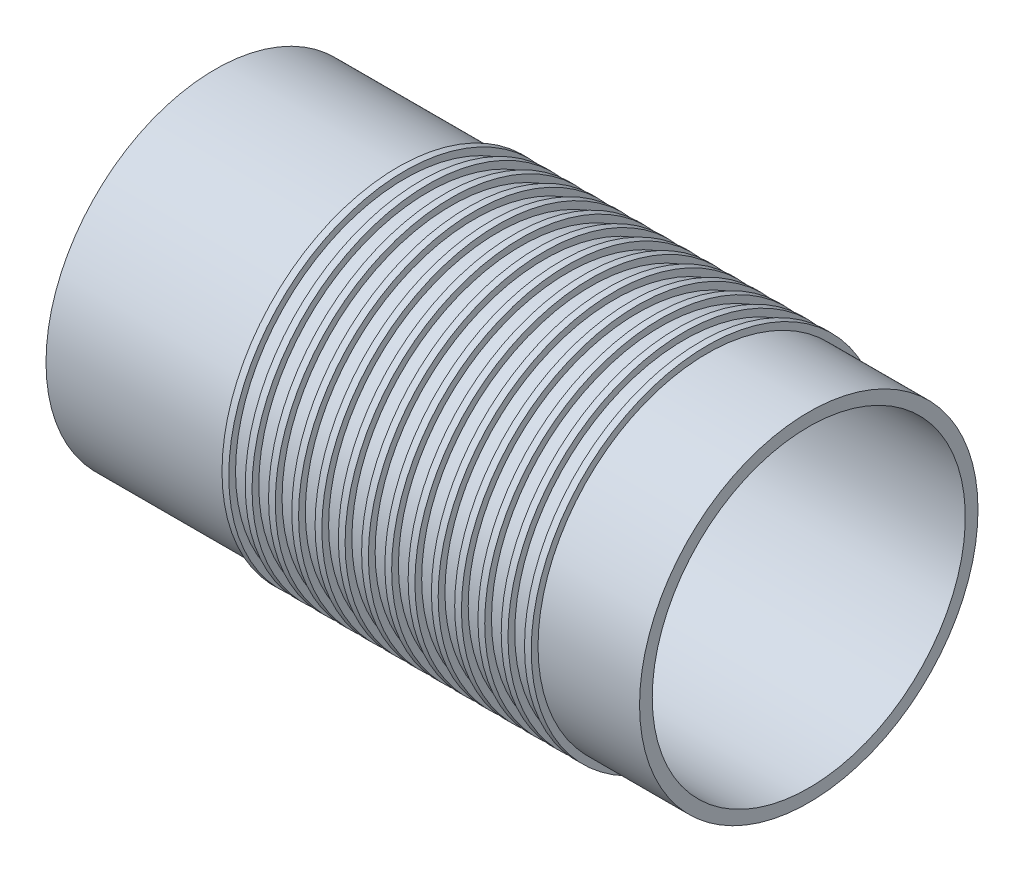
ISO-10303-21;
HEADER;
FILE_DESCRIPTION(('STEP AP214'),'2;1');
FILE_NAME('part.step','',(''),(''),'','','');
FILE_SCHEMA(('AUTOMOTIVE_DESIGN { 1 0 10303 214 1 1 1 1 }'));
ENDSEC;
DATA;
#1=APPLICATION_CONTEXT('core data for automotive mechanical design processes');
#2=APPLICATION_PROTOCOL_DEFINITION('international standard','automotive_design',2000,#1);
#3=PRODUCT_CONTEXT('',#1,'mechanical');
#4=PRODUCT('Part','Part','',(#3));
#5=PRODUCT_RELATED_PRODUCT_CATEGORY('part','',(#4));
#6=PRODUCT_DEFINITION_FORMATION('','',#4);
#7=PRODUCT_DEFINITION_CONTEXT('part definition',#1,'design');
#8=PRODUCT_DEFINITION('design','',#6,#7);
#9=PRODUCT_DEFINITION_SHAPE('','',#8);
#10=(LENGTH_UNIT() NAMED_UNIT(*) SI_UNIT(.MILLI.,.METRE.));
#11=(NAMED_UNIT(*) PLANE_ANGLE_UNIT() SI_UNIT($,.RADIAN.));
#12=(NAMED_UNIT(*) SI_UNIT($,.STERADIAN.) SOLID_ANGLE_UNIT());
#13=UNCERTAINTY_MEASURE_WITH_UNIT(LENGTH_MEASURE(1.E-05),#10,'distance_accuracy_value','');
#14=(GEOMETRIC_REPRESENTATION_CONTEXT(3) GLOBAL_UNCERTAINTY_ASSIGNED_CONTEXT((#13)) GLOBAL_UNIT_ASSIGNED_CONTEXT((#10,
#11,#12)) REPRESENTATION_CONTEXT('',''));
#15=CARTESIAN_POINT('',(0.,0.,0.));
#16=DIRECTION('',(0.,0.,1.));
#17=DIRECTION('',(1.,0.,0.));
#18=AXIS2_PLACEMENT_3D('',#15,#16,#17);
#19=CARTESIAN_POINT('',(-35.075,18.5,0.));
#20=DIRECTION('',(1.,0.,0.));
#21=DIRECTION('',(0.,0.,-1.));
#22=AXIS2_PLACEMENT_3D('',#19,#20,#21);
#23=PLANE('',#22);
#24=CARTESIAN_POINT('',(-35.075,0.,0.));
#25=DIRECTION('',(-1.,0.,0.));
#26=DIRECTION('',(0.,0.,1.));
#27=AXIS2_PLACEMENT_3D('',#24,#25,#26);
#28=CIRCLE('',#27,18.5);
#29=CARTESIAN_POINT('',(-35.075,0.,18.5));
#30=VERTEX_POINT('',#29);
#31=EDGE_CURVE('E10',#30,#30,#28,.T.);
#32=ORIENTED_EDGE('',*,*,#31,.F.);
#33=EDGE_LOOP('',(#32));
#34=FACE_BOUND('',#33,.T.);
#35=CARTESIAN_POINT('',(-35.075,0.,0.));
#36=DIRECTION('',(-1.,0.,0.));
#37=DIRECTION('',(0.,0.,1.));
#38=AXIS2_PLACEMENT_3D('',#35,#36,#37);
#39=CIRCLE('',#38,20.);
#40=CARTESIAN_POINT('',(-35.075,0.,20.));
#41=VERTEX_POINT('',#40);
#42=EDGE_CURVE('E227',#41,#41,#39,.T.);
#43=ORIENTED_EDGE('',*,*,#42,.T.);
#44=EDGE_LOOP('',(#43));
#45=FACE_BOUND('',#44,.T.);
#46=ADVANCED_FACE('F43',(#34,#45),#23,.F.);
#47=CARTESIAN_POINT('',(-100.187905083293,0.,0.));
#48=DIRECTION('',(-1.,0.,0.));
#49=DIRECTION('',(0.,0.,1.));
#50=AXIS2_PLACEMENT_3D('',#47,#48,#49);
#51=CYLINDRICAL_SURFACE('',#50,18.5);
#52=CARTESIAN_POINT('',(35.075,0.,0.));
#53=DIRECTION('',(-1.,0.,0.));
#54=DIRECTION('',(0.,0.,1.));
#55=AXIS2_PLACEMENT_3D('',#52,#53,#54);
#56=CIRCLE('',#55,18.5);
#57=CARTESIAN_POINT('',(35.075,0.,18.5));
#58=VERTEX_POINT('',#57);
#59=EDGE_CURVE('E49',#58,#58,#56,.T.);
#60=ORIENTED_EDGE('',*,*,#59,.F.);
#61=EDGE_LOOP('',(#60));
#62=FACE_BOUND('',#61,.T.);
#63=ORIENTED_EDGE('',*,*,#31,.T.);
#64=EDGE_LOOP('',(#63));
#65=FACE_BOUND('',#64,.T.);
#66=ADVANCED_FACE('F576',(#62,#65),#51,.F.);
#67=CARTESIAN_POINT('',(35.075,18.5,0.));
#68=DIRECTION('',(-1.,0.,0.));
#69=DIRECTION('',(0.,0.,1.));
#70=AXIS2_PLACEMENT_3D('',#67,#68,#69);
#71=PLANE('',#70);
#72=CARTESIAN_POINT('',(35.075,0.,0.));
#73=DIRECTION('',(-1.,0.,0.));
#74=DIRECTION('',(0.,0.,1.));
#75=AXIS2_PLACEMENT_3D('',#72,#73,#74);
#76=CIRCLE('',#75,20.);
#77=CARTESIAN_POINT('',(35.075,0.,20.));
#78=VERTEX_POINT('',#77);
#79=EDGE_CURVE('E53',#78,#78,#76,.T.);
#80=ORIENTED_EDGE('',*,*,#79,.F.);
#81=EDGE_LOOP('',(#80));
#82=FACE_BOUND('',#81,.T.);
#83=ORIENTED_EDGE('',*,*,#59,.T.);
#84=EDGE_LOOP('',(#83));
#85=FACE_BOUND('',#84,.T.);
#86=ADVANCED_FACE('F571',(#82,#85),#71,.F.);
#87=CARTESIAN_POINT('',(-100.187905083293,0.,0.));
#88=DIRECTION('',(-1.,0.,0.));
#89=DIRECTION('',(0.,0.,1.));
#90=AXIS2_PLACEMENT_3D('',#87,#88,#89);
#91=CYLINDRICAL_SURFACE('',#90,20.);
#92=CARTESIAN_POINT('',(23.075,0.,0.));
#93=DIRECTION('',(-1.,0.,0.));
#94=DIRECTION('',(0.,0.,1.));
#95=AXIS2_PLACEMENT_3D('',#92,#93,#94);
#96=CIRCLE('',#95,20.);
#97=CARTESIAN_POINT('',(23.075,0.,20.));
#98=VERTEX_POINT('',#97);
#99=EDGE_CURVE('E57',#98,#98,#96,.T.);
#100=ORIENTED_EDGE('',*,*,#99,.F.);
#101=EDGE_LOOP('',(#100));
#102=FACE_BOUND('',#101,.T.);
#103=ORIENTED_EDGE('',*,*,#79,.T.);
#104=EDGE_LOOP('',(#103));
#105=FACE_BOUND('',#104,.T.);
#106=ADVANCED_FACE('F565',(#102,#105),#91,.T.);
#107=CARTESIAN_POINT('',(23.075,20.,0.));
#108=DIRECTION('',(-1.,0.,0.));
#109=DIRECTION('',(0.,0.,1.));
#110=AXIS2_PLACEMENT_3D('',#107,#108,#109);
#111=PLANE('',#110);
#112=CARTESIAN_POINT('',(23.075,0.,0.));
#113=DIRECTION('',(-1.,0.,0.));
#114=DIRECTION('',(0.,0.,1.));
#115=AXIS2_PLACEMENT_3D('',#112,#113,#114);
#116=CIRCLE('',#115,20.8);
#117=CARTESIAN_POINT('',(23.075,0.,20.8));
#118=VERTEX_POINT('',#117);
#119=EDGE_CURVE('E62',#118,#118,#116,.T.);
#120=ORIENTED_EDGE('',*,*,#119,.F.);
#121=EDGE_LOOP('',(#120));
#122=FACE_BOUND('',#121,.T.);
#123=ORIENTED_EDGE('',*,*,#99,.T.);
#124=EDGE_LOOP('',(#123));
#125=FACE_BOUND('',#124,.T.);
#126=ADVANCED_FACE('F559',(#122,#125),#111,.F.);
#127=CARTESIAN_POINT('',(-100.187905083293,0.,0.));
#128=DIRECTION('',(-1.,0.,0.));
#129=DIRECTION('',(0.,0.,1.));
#130=AXIS2_PLACEMENT_3D('',#127,#128,#129);
#131=CYLINDRICAL_SURFACE('',#130,20.8);
#132=CARTESIAN_POINT('',(22.275,0.,0.));
#133=DIRECTION('',(-1.,0.,0.));
#134=DIRECTION('',(0.,0.,1.));
#135=AXIS2_PLACEMENT_3D('',#132,#133,#134);
#136=CIRCLE('',#135,20.8);
#137=CARTESIAN_POINT('',(22.275,0.,20.8));
#138=VERTEX_POINT('',#137);
#139=EDGE_CURVE('E65',#138,#138,#136,.T.);
#140=ORIENTED_EDGE('',*,*,#139,.F.);
#141=EDGE_LOOP('',(#140));
#142=FACE_BOUND('',#141,.T.);
#143=ORIENTED_EDGE('',*,*,#119,.T.);
#144=EDGE_LOOP('',(#143));
#145=FACE_BOUND('',#144,.T.);
#146=ADVANCED_FACE('F553',(#142,#145),#131,.T.);
#147=CARTESIAN_POINT('',(22.275,20.8,0.));
#148=DIRECTION('',(1.,0.,0.));
#149=DIRECTION('',(0.,0.,-1.));
#150=AXIS2_PLACEMENT_3D('',#147,#148,#149);
#151=PLANE('',#150);
#152=CARTESIAN_POINT('',(22.275,0.,0.));
#153=DIRECTION('',(-1.,0.,0.));
#154=DIRECTION('',(0.,0.,1.));
#155=AXIS2_PLACEMENT_3D('',#152,#153,#154);
#156=CIRCLE('',#155,20.);
#157=CARTESIAN_POINT('',(22.275,0.,20.));
#158=VERTEX_POINT('',#157);
#159=EDGE_CURVE('E68',#158,#158,#156,.T.);
#160=ORIENTED_EDGE('',*,*,#159,.F.);
#161=EDGE_LOOP('',(#160));
#162=FACE_BOUND('',#161,.T.);
#163=ORIENTED_EDGE('',*,*,#139,.T.);
#164=EDGE_LOOP('',(#163));
#165=FACE_BOUND('',#164,.T.);
#166=ADVANCED_FACE('F547',(#162,#165),#151,.F.);
#167=CARTESIAN_POINT('',(-100.187905083293,0.,0.));
#168=DIRECTION('',(-1.,0.,0.));
#169=DIRECTION('',(0.,0.,1.));
#170=AXIS2_PLACEMENT_3D('',#167,#168,#169);
#171=CYLINDRICAL_SURFACE('',#170,20.);
#172=CARTESIAN_POINT('',(20.325,0.,0.));
#173=DIRECTION('',(-1.,0.,0.));
#174=DIRECTION('',(0.,0.,1.));
#175=AXIS2_PLACEMENT_3D('',#172,#173,#174);
#176=CIRCLE('',#175,20.);
#177=CARTESIAN_POINT('',(20.325,0.,20.));
#178=VERTEX_POINT('',#177);
#179=EDGE_CURVE('E71',#178,#178,#176,.T.);
#180=ORIENTED_EDGE('',*,*,#179,.F.);
#181=EDGE_LOOP('',(#180));
#182=FACE_BOUND('',#181,.T.);
#183=ORIENTED_EDGE('',*,*,#159,.T.);
#184=EDGE_LOOP('',(#183));
#185=FACE_BOUND('',#184,.T.);
#186=ADVANCED_FACE('F541',(#182,#185),#171,.T.);
#187=CARTESIAN_POINT('',(20.325,20.,0.));
#188=DIRECTION('',(-1.,0.,0.));
#189=DIRECTION('',(0.,0.,1.));
#190=AXIS2_PLACEMENT_3D('',#187,#188,#189);
#191=PLANE('',#190);
#192=CARTESIAN_POINT('',(20.325,0.,0.));
#193=DIRECTION('',(-1.,0.,0.));
#194=DIRECTION('',(0.,0.,1.));
#195=AXIS2_PLACEMENT_3D('',#192,#193,#194);
#196=CIRCLE('',#195,20.8);
#197=CARTESIAN_POINT('',(20.325,0.,20.8));
#198=VERTEX_POINT('',#197);
#199=EDGE_CURVE('E74',#198,#198,#196,.T.);
#200=ORIENTED_EDGE('',*,*,#199,.F.);
#201=EDGE_LOOP('',(#200));
#202=FACE_BOUND('',#201,.T.);
#203=ORIENTED_EDGE('',*,*,#179,.T.);
#204=EDGE_LOOP('',(#203));
#205=FACE_BOUND('',#204,.T.);
#206=ADVANCED_FACE('F535',(#202,#205),#191,.F.);
#207=CARTESIAN_POINT('',(-100.187905083293,0.,0.));
#208=DIRECTION('',(-1.,0.,0.));
#209=DIRECTION('',(0.,0.,1.));
#210=AXIS2_PLACEMENT_3D('',#207,#208,#209);
#211=CYLINDRICAL_SURFACE('',#210,20.8);
#212=CARTESIAN_POINT('',(19.525,0.,0.));
#213=DIRECTION('',(-1.,0.,0.));
#214=DIRECTION('',(0.,0.,1.));
#215=AXIS2_PLACEMENT_3D('',#212,#213,#214);
#216=CIRCLE('',#215,20.8);
#217=CARTESIAN_POINT('',(19.525,0.,20.8));
#218=VERTEX_POINT('',#217);
#219=EDGE_CURVE('E77',#218,#218,#216,.T.);
#220=ORIENTED_EDGE('',*,*,#219,.F.);
#221=EDGE_LOOP('',(#220));
#222=FACE_BOUND('',#221,.T.);
#223=ORIENTED_EDGE('',*,*,#199,.T.);
#224=EDGE_LOOP('',(#223));
#225=FACE_BOUND('',#224,.T.);
#226=ADVANCED_FACE('F529',(#222,#225),#211,.T.);
#227=CARTESIAN_POINT('',(19.525,20.8,0.));
#228=DIRECTION('',(1.,0.,0.));
#229=DIRECTION('',(0.,0.,-1.));
#230=AXIS2_PLACEMENT_3D('',#227,#228,#229);
#231=PLANE('',#230);
#232=CARTESIAN_POINT('',(19.525,0.,0.));
#233=DIRECTION('',(-1.,0.,0.));
#234=DIRECTION('',(0.,0.,1.));
#235=AXIS2_PLACEMENT_3D('',#232,#233,#234);
#236=CIRCLE('',#235,20.);
#237=CARTESIAN_POINT('',(19.525,0.,20.));
#238=VERTEX_POINT('',#237);
#239=EDGE_CURVE('E80',#238,#238,#236,.T.);
#240=ORIENTED_EDGE('',*,*,#239,.F.);
#241=EDGE_LOOP('',(#240));
#242=FACE_BOUND('',#241,.T.);
#243=ORIENTED_EDGE('',*,*,#219,.T.);
#244=EDGE_LOOP('',(#243));
#245=FACE_BOUND('',#244,.T.);
#246=ADVANCED_FACE('F523',(#242,#245),#231,.F.);
#247=CARTESIAN_POINT('',(-100.187905083293,0.,0.));
#248=DIRECTION('',(-1.,0.,0.));
#249=DIRECTION('',(0.,0.,1.));
#250=AXIS2_PLACEMENT_3D('',#247,#248,#249);
#251=CYLINDRICAL_SURFACE('',#250,20.);
#252=CARTESIAN_POINT('',(17.575,0.,0.));
#253=DIRECTION('',(-1.,0.,0.));
#254=DIRECTION('',(0.,0.,1.));
#255=AXIS2_PLACEMENT_3D('',#252,#253,#254);
#256=CIRCLE('',#255,20.);
#257=CARTESIAN_POINT('',(17.575,0.,20.));
#258=VERTEX_POINT('',#257);
#259=EDGE_CURVE('E83',#258,#258,#256,.T.);
#260=ORIENTED_EDGE('',*,*,#259,.F.);
#261=EDGE_LOOP('',(#260));
#262=FACE_BOUND('',#261,.T.);
#263=ORIENTED_EDGE('',*,*,#239,.T.);
#264=EDGE_LOOP('',(#263));
#265=FACE_BOUND('',#264,.T.);
#266=ADVANCED_FACE('F517',(#262,#265),#251,.T.);
#267=CARTESIAN_POINT('',(17.575,20.,0.));
#268=DIRECTION('',(-1.,0.,0.));
#269=DIRECTION('',(0.,0.,1.));
#270=AXIS2_PLACEMENT_3D('',#267,#268,#269);
#271=PLANE('',#270);
#272=CARTESIAN_POINT('',(17.575,0.,0.));
#273=DIRECTION('',(-1.,0.,0.));
#274=DIRECTION('',(0.,0.,1.));
#275=AXIS2_PLACEMENT_3D('',#272,#273,#274);
#276=CIRCLE('',#275,20.8);
#277=CARTESIAN_POINT('',(17.575,0.,20.8));
#278=VERTEX_POINT('',#277);
#279=EDGE_CURVE('E86',#278,#278,#276,.T.);
#280=ORIENTED_EDGE('',*,*,#279,.F.);
#281=EDGE_LOOP('',(#280));
#282=FACE_BOUND('',#281,.T.);
#283=ORIENTED_EDGE('',*,*,#259,.T.);
#284=EDGE_LOOP('',(#283));
#285=FACE_BOUND('',#284,.T.);
#286=ADVANCED_FACE('F511',(#282,#285),#271,.F.);
#287=CARTESIAN_POINT('',(-100.187905083293,0.,0.));
#288=DIRECTION('',(-1.,0.,0.));
#289=DIRECTION('',(0.,0.,1.));
#290=AXIS2_PLACEMENT_3D('',#287,#288,#289);
#291=CYLINDRICAL_SURFACE('',#290,20.8);
#292=CARTESIAN_POINT('',(16.775,0.,0.));
#293=DIRECTION('',(-1.,0.,0.));
#294=DIRECTION('',(0.,0.,1.));
#295=AXIS2_PLACEMENT_3D('',#292,#293,#294);
#296=CIRCLE('',#295,20.8);
#297=CARTESIAN_POINT('',(16.775,0.,20.8));
#298=VERTEX_POINT('',#297);
#299=EDGE_CURVE('E89',#298,#298,#296,.T.);
#300=ORIENTED_EDGE('',*,*,#299,.F.);
#301=EDGE_LOOP('',(#300));
#302=FACE_BOUND('',#301,.T.);
#303=ORIENTED_EDGE('',*,*,#279,.T.);
#304=EDGE_LOOP('',(#303));
#305=FACE_BOUND('',#304,.T.);
#306=ADVANCED_FACE('F505',(#302,#305),#291,.T.);
#307=CARTESIAN_POINT('',(16.775,20.8,0.));
#308=DIRECTION('',(1.,0.,0.));
#309=DIRECTION('',(0.,0.,-1.));
#310=AXIS2_PLACEMENT_3D('',#307,#308,#309);
#311=PLANE('',#310);
#312=CARTESIAN_POINT('',(16.775,0.,0.));
#313=DIRECTION('',(-1.,0.,0.));
#314=DIRECTION('',(0.,0.,1.));
#315=AXIS2_PLACEMENT_3D('',#312,#313,#314);
#316=CIRCLE('',#315,20.);
#317=CARTESIAN_POINT('',(16.775,0.,20.));
#318=VERTEX_POINT('',#317);
#319=EDGE_CURVE('E92',#318,#318,#316,.T.);
#320=ORIENTED_EDGE('',*,*,#319,.F.);
#321=EDGE_LOOP('',(#320));
#322=FACE_BOUND('',#321,.T.);
#323=ORIENTED_EDGE('',*,*,#299,.T.);
#324=EDGE_LOOP('',(#323));
#325=FACE_BOUND('',#324,.T.);
#326=ADVANCED_FACE('F499',(#322,#325),#311,.F.);
#327=CARTESIAN_POINT('',(-100.187905083293,0.,0.));
#328=DIRECTION('',(-1.,0.,0.));
#329=DIRECTION('',(0.,0.,1.));
#330=AXIS2_PLACEMENT_3D('',#327,#328,#329);
#331=CYLINDRICAL_SURFACE('',#330,20.);
#332=CARTESIAN_POINT('',(14.825,0.,0.));
#333=DIRECTION('',(-1.,0.,0.));
#334=DIRECTION('',(0.,0.,1.));
#335=AXIS2_PLACEMENT_3D('',#332,#333,#334);
#336=CIRCLE('',#335,20.);
#337=CARTESIAN_POINT('',(14.825,0.,20.));
#338=VERTEX_POINT('',#337);
#339=EDGE_CURVE('E95',#338,#338,#336,.T.);
#340=ORIENTED_EDGE('',*,*,#339,.F.);
#341=EDGE_LOOP('',(#340));
#342=FACE_BOUND('',#341,.T.);
#343=ORIENTED_EDGE('',*,*,#319,.T.);
#344=EDGE_LOOP('',(#343));
#345=FACE_BOUND('',#344,.T.);
#346=ADVANCED_FACE('F493',(#342,#345),#331,.T.);
#347=CARTESIAN_POINT('',(14.825,20.,0.));
#348=DIRECTION('',(-1.,0.,0.));
#349=DIRECTION('',(0.,0.,1.));
#350=AXIS2_PLACEMENT_3D('',#347,#348,#349);
#351=PLANE('',#350);
#352=CARTESIAN_POINT('',(14.825,0.,0.));
#353=DIRECTION('',(-1.,0.,0.));
#354=DIRECTION('',(0.,0.,1.));
#355=AXIS2_PLACEMENT_3D('',#352,#353,#354);
#356=CIRCLE('',#355,20.8);
#357=CARTESIAN_POINT('',(14.825,0.,20.8));
#358=VERTEX_POINT('',#357);
#359=EDGE_CURVE('E98',#358,#358,#356,.T.);
#360=ORIENTED_EDGE('',*,*,#359,.F.);
#361=EDGE_LOOP('',(#360));
#362=FACE_BOUND('',#361,.T.);
#363=ORIENTED_EDGE('',*,*,#339,.T.);
#364=EDGE_LOOP('',(#363));
#365=FACE_BOUND('',#364,.T.);
#366=ADVANCED_FACE('F487',(#362,#365),#351,.F.);
#367=CARTESIAN_POINT('',(-100.187905083293,0.,0.));
#368=DIRECTION('',(-1.,0.,0.));
#369=DIRECTION('',(0.,0.,1.));
#370=AXIS2_PLACEMENT_3D('',#367,#368,#369);
#371=CYLINDRICAL_SURFACE('',#370,20.8);
#372=CARTESIAN_POINT('',(14.025,0.,0.));
#373=DIRECTION('',(-1.,0.,0.));
#374=DIRECTION('',(0.,0.,1.));
#375=AXIS2_PLACEMENT_3D('',#372,#373,#374);
#376=CIRCLE('',#375,20.8);
#377=CARTESIAN_POINT('',(14.025,0.,20.8));
#378=VERTEX_POINT('',#377);
#379=EDGE_CURVE('E101',#378,#378,#376,.T.);
#380=ORIENTED_EDGE('',*,*,#379,.F.);
#381=EDGE_LOOP('',(#380));
#382=FACE_BOUND('',#381,.T.);
#383=ORIENTED_EDGE('',*,*,#359,.T.);
#384=EDGE_LOOP('',(#383));
#385=FACE_BOUND('',#384,.T.);
#386=ADVANCED_FACE('F481',(#382,#385),#371,.T.);
#387=CARTESIAN_POINT('',(14.025,20.8,0.));
#388=DIRECTION('',(1.,0.,0.));
#389=DIRECTION('',(0.,0.,-1.));
#390=AXIS2_PLACEMENT_3D('',#387,#388,#389);
#391=PLANE('',#390);
#392=CARTESIAN_POINT('',(14.025,0.,0.));
#393=DIRECTION('',(-1.,0.,0.));
#394=DIRECTION('',(0.,0.,1.));
#395=AXIS2_PLACEMENT_3D('',#392,#393,#394);
#396=CIRCLE('',#395,20.);
#397=CARTESIAN_POINT('',(14.025,0.,20.));
#398=VERTEX_POINT('',#397);
#399=EDGE_CURVE('E104',#398,#398,#396,.T.);
#400=ORIENTED_EDGE('',*,*,#399,.F.);
#401=EDGE_LOOP('',(#400));
#402=FACE_BOUND('',#401,.T.);
#403=ORIENTED_EDGE('',*,*,#379,.T.);
#404=EDGE_LOOP('',(#403));
#405=FACE_BOUND('',#404,.T.);
#406=ADVANCED_FACE('F475',(#402,#405),#391,.F.);
#407=CARTESIAN_POINT('',(-100.187905083293,0.,0.));
#408=DIRECTION('',(-1.,0.,0.));
#409=DIRECTION('',(0.,0.,1.));
#410=AXIS2_PLACEMENT_3D('',#407,#408,#409);
#411=CYLINDRICAL_SURFACE('',#410,20.);
#412=CARTESIAN_POINT('',(12.075,0.,0.));
#413=DIRECTION('',(-1.,0.,0.));
#414=DIRECTION('',(0.,0.,1.));
#415=AXIS2_PLACEMENT_3D('',#412,#413,#414);
#416=CIRCLE('',#415,20.);
#417=CARTESIAN_POINT('',(12.075,0.,20.));
#418=VERTEX_POINT('',#417);
#419=EDGE_CURVE('E107',#418,#418,#416,.T.);
#420=ORIENTED_EDGE('',*,*,#419,.F.);
#421=EDGE_LOOP('',(#420));
#422=FACE_BOUND('',#421,.T.);
#423=ORIENTED_EDGE('',*,*,#399,.T.);
#424=EDGE_LOOP('',(#423));
#425=FACE_BOUND('',#424,.T.);
#426=ADVANCED_FACE('F469',(#422,#425),#411,.T.);
#427=CARTESIAN_POINT('',(12.075,20.,0.));
#428=DIRECTION('',(-1.,0.,0.));
#429=DIRECTION('',(0.,0.,1.));
#430=AXIS2_PLACEMENT_3D('',#427,#428,#429);
#431=PLANE('',#430);
#432=CARTESIAN_POINT('',(12.075,0.,0.));
#433=DIRECTION('',(-1.,0.,0.));
#434=DIRECTION('',(0.,0.,1.));
#435=AXIS2_PLACEMENT_3D('',#432,#433,#434);
#436=CIRCLE('',#435,20.8);
#437=CARTESIAN_POINT('',(12.075,0.,20.8));
#438=VERTEX_POINT('',#437);
#439=EDGE_CURVE('E110',#438,#438,#436,.T.);
#440=ORIENTED_EDGE('',*,*,#439,.F.);
#441=EDGE_LOOP('',(#440));
#442=FACE_BOUND('',#441,.T.);
#443=ORIENTED_EDGE('',*,*,#419,.T.);
#444=EDGE_LOOP('',(#443));
#445=FACE_BOUND('',#444,.T.);
#446=ADVANCED_FACE('F463',(#442,#445),#431,.F.);
#447=CARTESIAN_POINT('',(-100.187905083293,0.,0.));
#448=DIRECTION('',(-1.,0.,0.));
#449=DIRECTION('',(0.,0.,1.));
#450=AXIS2_PLACEMENT_3D('',#447,#448,#449);
#451=CYLINDRICAL_SURFACE('',#450,20.8);
#452=CARTESIAN_POINT('',(11.275,0.,0.));
#453=DIRECTION('',(-1.,0.,0.));
#454=DIRECTION('',(0.,0.,1.));
#455=AXIS2_PLACEMENT_3D('',#452,#453,#454);
#456=CIRCLE('',#455,20.8);
#457=CARTESIAN_POINT('',(11.275,0.,20.8));
#458=VERTEX_POINT('',#457);
#459=EDGE_CURVE('E113',#458,#458,#456,.T.);
#460=ORIENTED_EDGE('',*,*,#459,.F.);
#461=EDGE_LOOP('',(#460));
#462=FACE_BOUND('',#461,.T.);
#463=ORIENTED_EDGE('',*,*,#439,.T.);
#464=EDGE_LOOP('',(#463));
#465=FACE_BOUND('',#464,.T.);
#466=ADVANCED_FACE('F457',(#462,#465),#451,.T.);
#467=CARTESIAN_POINT('',(11.275,20.8,0.));
#468=DIRECTION('',(1.,0.,0.));
#469=DIRECTION('',(0.,0.,-1.));
#470=AXIS2_PLACEMENT_3D('',#467,#468,#469);
#471=PLANE('',#470);
#472=CARTESIAN_POINT('',(11.275,0.,0.));
#473=DIRECTION('',(-1.,0.,0.));
#474=DIRECTION('',(0.,0.,1.));
#475=AXIS2_PLACEMENT_3D('',#472,#473,#474);
#476=CIRCLE('',#475,20.);
#477=CARTESIAN_POINT('',(11.275,0.,20.));
#478=VERTEX_POINT('',#477);
#479=EDGE_CURVE('E116',#478,#478,#476,.T.);
#480=ORIENTED_EDGE('',*,*,#479,.F.);
#481=EDGE_LOOP('',(#480));
#482=FACE_BOUND('',#481,.T.);
#483=ORIENTED_EDGE('',*,*,#459,.T.);
#484=EDGE_LOOP('',(#483));
#485=FACE_BOUND('',#484,.T.);
#486=ADVANCED_FACE('F451',(#482,#485),#471,.F.);
#487=CARTESIAN_POINT('',(-100.187905083293,0.,0.));
#488=DIRECTION('',(-1.,0.,0.));
#489=DIRECTION('',(0.,0.,1.));
#490=AXIS2_PLACEMENT_3D('',#487,#488,#489);
#491=CYLINDRICAL_SURFACE('',#490,20.);
#492=CARTESIAN_POINT('',(9.325,0.,0.));
#493=DIRECTION('',(-1.,0.,0.));
#494=DIRECTION('',(0.,0.,1.));
#495=AXIS2_PLACEMENT_3D('',#492,#493,#494);
#496=CIRCLE('',#495,20.);
#497=CARTESIAN_POINT('',(9.325,0.,20.));
#498=VERTEX_POINT('',#497);
#499=EDGE_CURVE('E119',#498,#498,#496,.T.);
#500=ORIENTED_EDGE('',*,*,#499,.F.);
#501=EDGE_LOOP('',(#500));
#502=FACE_BOUND('',#501,.T.);
#503=ORIENTED_EDGE('',*,*,#479,.T.);
#504=EDGE_LOOP('',(#503));
#505=FACE_BOUND('',#504,.T.);
#506=ADVANCED_FACE('F445',(#502,#505),#491,.T.);
#507=CARTESIAN_POINT('',(9.32500000000001,20.,0.));
#508=DIRECTION('',(-1.,0.,0.));
#509=DIRECTION('',(0.,0.,1.));
#510=AXIS2_PLACEMENT_3D('',#507,#508,#509);
#511=PLANE('',#510);
#512=CARTESIAN_POINT('',(9.325,0.,0.));
#513=DIRECTION('',(-1.,0.,0.));
#514=DIRECTION('',(0.,0.,1.));
#515=AXIS2_PLACEMENT_3D('',#512,#513,#514);
#516=CIRCLE('',#515,20.8);
#517=CARTESIAN_POINT('',(9.325,0.,20.8));
#518=VERTEX_POINT('',#517);
#519=EDGE_CURVE('E122',#518,#518,#516,.T.);
#520=ORIENTED_EDGE('',*,*,#519,.F.);
#521=EDGE_LOOP('',(#520));
#522=FACE_BOUND('',#521,.T.);
#523=ORIENTED_EDGE('',*,*,#499,.T.);
#524=EDGE_LOOP('',(#523));
#525=FACE_BOUND('',#524,.T.);
#526=ADVANCED_FACE('F439',(#522,#525),#511,.F.);
#527=CARTESIAN_POINT('',(-100.187905083293,0.,0.));
#528=DIRECTION('',(-1.,0.,0.));
#529=DIRECTION('',(0.,0.,1.));
#530=AXIS2_PLACEMENT_3D('',#527,#528,#529);
#531=CYLINDRICAL_SURFACE('',#530,20.8);
#532=CARTESIAN_POINT('',(8.52500000000001,0.,0.));
#533=DIRECTION('',(-1.,0.,0.));
#534=DIRECTION('',(0.,0.,1.));
#535=AXIS2_PLACEMENT_3D('',#532,#533,#534);
#536=CIRCLE('',#535,20.8);
#537=CARTESIAN_POINT('',(8.52500000000001,0.,20.8));
#538=VERTEX_POINT('',#537);
#539=EDGE_CURVE('E125',#538,#538,#536,.T.);
#540=ORIENTED_EDGE('',*,*,#539,.F.);
#541=EDGE_LOOP('',(#540));
#542=FACE_BOUND('',#541,.T.);
#543=ORIENTED_EDGE('',*,*,#519,.T.);
#544=EDGE_LOOP('',(#543));
#545=FACE_BOUND('',#544,.T.);
#546=ADVANCED_FACE('F433',(#542,#545),#531,.T.);
#547=CARTESIAN_POINT('',(8.52500000000001,20.8,0.));
#548=DIRECTION('',(1.,0.,0.));
#549=DIRECTION('',(0.,0.,-1.));
#550=AXIS2_PLACEMENT_3D('',#547,#548,#549);
#551=PLANE('',#550);
#552=CARTESIAN_POINT('',(8.52500000000001,0.,0.));
#553=DIRECTION('',(-1.,0.,0.));
#554=DIRECTION('',(0.,0.,1.));
#555=AXIS2_PLACEMENT_3D('',#552,#553,#554);
#556=CIRCLE('',#555,20.);
#557=CARTESIAN_POINT('',(8.52500000000001,0.,20.));
#558=VERTEX_POINT('',#557);
#559=EDGE_CURVE('E128',#558,#558,#556,.T.);
#560=ORIENTED_EDGE('',*,*,#559,.F.);
#561=EDGE_LOOP('',(#560));
#562=FACE_BOUND('',#561,.T.);
#563=ORIENTED_EDGE('',*,*,#539,.T.);
#564=EDGE_LOOP('',(#563));
#565=FACE_BOUND('',#564,.T.);
#566=ADVANCED_FACE('F427',(#562,#565),#551,.F.);
#567=CARTESIAN_POINT('',(-100.187905083293,0.,0.));
#568=DIRECTION('',(-1.,0.,0.));
#569=DIRECTION('',(0.,0.,1.));
#570=AXIS2_PLACEMENT_3D('',#567,#568,#569);
#571=CYLINDRICAL_SURFACE('',#570,20.);
#572=CARTESIAN_POINT('',(6.57500000000001,0.,0.));
#573=DIRECTION('',(-1.,0.,0.));
#574=DIRECTION('',(0.,0.,1.));
#575=AXIS2_PLACEMENT_3D('',#572,#573,#574);
#576=CIRCLE('',#575,20.);
#577=CARTESIAN_POINT('',(6.57500000000001,0.,20.));
#578=VERTEX_POINT('',#577);
#579=EDGE_CURVE('E131',#578,#578,#576,.T.);
#580=ORIENTED_EDGE('',*,*,#579,.F.);
#581=EDGE_LOOP('',(#580));
#582=FACE_BOUND('',#581,.T.);
#583=ORIENTED_EDGE('',*,*,#559,.T.);
#584=EDGE_LOOP('',(#583));
#585=FACE_BOUND('',#584,.T.);
#586=ADVANCED_FACE('F421',(#582,#585),#571,.T.);
#587=CARTESIAN_POINT('',(6.57500000000001,20.,0.));
#588=DIRECTION('',(-1.,0.,0.));
#589=DIRECTION('',(0.,0.,1.));
#590=AXIS2_PLACEMENT_3D('',#587,#588,#589);
#591=PLANE('',#590);
#592=CARTESIAN_POINT('',(6.57500000000001,0.,0.));
#593=DIRECTION('',(-1.,0.,0.));
#594=DIRECTION('',(0.,0.,1.));
#595=AXIS2_PLACEMENT_3D('',#592,#593,#594);
#596=CIRCLE('',#595,20.8);
#597=CARTESIAN_POINT('',(6.57500000000001,0.,20.8));
#598=VERTEX_POINT('',#597);
#599=EDGE_CURVE('E134',#598,#598,#596,.T.);
#600=ORIENTED_EDGE('',*,*,#599,.F.);
#601=EDGE_LOOP('',(#600));
#602=FACE_BOUND('',#601,.T.);
#603=ORIENTED_EDGE('',*,*,#579,.T.);
#604=EDGE_LOOP('',(#603));
#605=FACE_BOUND('',#604,.T.);
#606=ADVANCED_FACE('F415',(#602,#605),#591,.F.);
#607=CARTESIAN_POINT('',(-100.187905083293,0.,0.));
#608=DIRECTION('',(-1.,0.,0.));
#609=DIRECTION('',(0.,0.,1.));
#610=AXIS2_PLACEMENT_3D('',#607,#608,#609);
#611=CYLINDRICAL_SURFACE('',#610,20.8);
#612=CARTESIAN_POINT('',(5.775,0.,0.));
#613=DIRECTION('',(-1.,0.,0.));
#614=DIRECTION('',(0.,0.,1.));
#615=AXIS2_PLACEMENT_3D('',#612,#613,#614);
#616=CIRCLE('',#615,20.8);
#617=CARTESIAN_POINT('',(5.775,0.,20.8));
#618=VERTEX_POINT('',#617);
#619=EDGE_CURVE('E137',#618,#618,#616,.T.);
#620=ORIENTED_EDGE('',*,*,#619,.F.);
#621=EDGE_LOOP('',(#620));
#622=FACE_BOUND('',#621,.T.);
#623=ORIENTED_EDGE('',*,*,#599,.T.);
#624=EDGE_LOOP('',(#623));
#625=FACE_BOUND('',#624,.T.);
#626=ADVANCED_FACE('F409',(#622,#625),#611,.T.);
#627=CARTESIAN_POINT('',(5.77500000000001,20.8,0.));
#628=DIRECTION('',(1.,0.,0.));
#629=DIRECTION('',(0.,0.,-1.));
#630=AXIS2_PLACEMENT_3D('',#627,#628,#629);
#631=PLANE('',#630);
#632=CARTESIAN_POINT('',(5.775,0.,0.));
#633=DIRECTION('',(-1.,0.,0.));
#634=DIRECTION('',(0.,0.,1.));
#635=AXIS2_PLACEMENT_3D('',#632,#633,#634);
#636=CIRCLE('',#635,20.);
#637=CARTESIAN_POINT('',(5.775,0.,20.));
#638=VERTEX_POINT('',#637);
#639=EDGE_CURVE('E140',#638,#638,#636,.T.);
#640=ORIENTED_EDGE('',*,*,#639,.F.);
#641=EDGE_LOOP('',(#640));
#642=FACE_BOUND('',#641,.T.);
#643=ORIENTED_EDGE('',*,*,#619,.T.);
#644=EDGE_LOOP('',(#643));
#645=FACE_BOUND('',#644,.T.);
#646=ADVANCED_FACE('F403',(#642,#645),#631,.F.);
#647=CARTESIAN_POINT('',(-100.187905083293,0.,0.));
#648=DIRECTION('',(-1.,0.,0.));
#649=DIRECTION('',(0.,0.,1.));
#650=AXIS2_PLACEMENT_3D('',#647,#648,#649);
#651=CYLINDRICAL_SURFACE('',#650,20.);
#652=CARTESIAN_POINT('',(3.82500000000001,0.,0.));
#653=DIRECTION('',(-1.,0.,0.));
#654=DIRECTION('',(0.,0.,1.));
#655=AXIS2_PLACEMENT_3D('',#652,#653,#654);
#656=CIRCLE('',#655,20.);
#657=CARTESIAN_POINT('',(3.82500000000001,0.,20.));
#658=VERTEX_POINT('',#657);
#659=EDGE_CURVE('E143',#658,#658,#656,.T.);
#660=ORIENTED_EDGE('',*,*,#659,.F.);
#661=EDGE_LOOP('',(#660));
#662=FACE_BOUND('',#661,.T.);
#663=ORIENTED_EDGE('',*,*,#639,.T.);
#664=EDGE_LOOP('',(#663));
#665=FACE_BOUND('',#664,.T.);
#666=ADVANCED_FACE('F397',(#662,#665),#651,.T.);
#667=CARTESIAN_POINT('',(3.82500000000001,20.,0.));
#668=DIRECTION('',(-1.,0.,0.));
#669=DIRECTION('',(0.,0.,1.));
#670=AXIS2_PLACEMENT_3D('',#667,#668,#669);
#671=PLANE('',#670);
#672=CARTESIAN_POINT('',(3.82500000000001,0.,0.));
#673=DIRECTION('',(-1.,0.,0.));
#674=DIRECTION('',(0.,0.,1.));
#675=AXIS2_PLACEMENT_3D('',#672,#673,#674);
#676=CIRCLE('',#675,20.8);
#677=CARTESIAN_POINT('',(3.82500000000001,0.,20.8));
#678=VERTEX_POINT('',#677);
#679=EDGE_CURVE('E146',#678,#678,#676,.T.);
#680=ORIENTED_EDGE('',*,*,#679,.F.);
#681=EDGE_LOOP('',(#680));
#682=FACE_BOUND('',#681,.T.);
#683=ORIENTED_EDGE('',*,*,#659,.T.);
#684=EDGE_LOOP('',(#683));
#685=FACE_BOUND('',#684,.T.);
#686=ADVANCED_FACE('F391',(#682,#685),#671,.F.);
#687=CARTESIAN_POINT('',(-100.187905083293,0.,0.));
#688=DIRECTION('',(-1.,0.,0.));
#689=DIRECTION('',(0.,0.,1.));
#690=AXIS2_PLACEMENT_3D('',#687,#688,#689);
#691=CYLINDRICAL_SURFACE('',#690,20.8);
#692=CARTESIAN_POINT('',(3.02500000000001,0.,0.));
#693=DIRECTION('',(-1.,0.,0.));
#694=DIRECTION('',(0.,0.,1.));
#695=AXIS2_PLACEMENT_3D('',#692,#693,#694);
#696=CIRCLE('',#695,20.8);
#697=CARTESIAN_POINT('',(3.02500000000001,0.,20.8));
#698=VERTEX_POINT('',#697);
#699=EDGE_CURVE('E149',#698,#698,#696,.T.);
#700=ORIENTED_EDGE('',*,*,#699,.F.);
#701=EDGE_LOOP('',(#700));
#702=FACE_BOUND('',#701,.T.);
#703=ORIENTED_EDGE('',*,*,#679,.T.);
#704=EDGE_LOOP('',(#703));
#705=FACE_BOUND('',#704,.T.);
#706=ADVANCED_FACE('F385',(#702,#705),#691,.T.);
#707=CARTESIAN_POINT('',(3.02500000000001,20.8,0.));
#708=DIRECTION('',(1.,0.,0.));
#709=DIRECTION('',(0.,0.,-1.));
#710=AXIS2_PLACEMENT_3D('',#707,#708,#709);
#711=PLANE('',#710);
#712=CARTESIAN_POINT('',(3.02500000000001,0.,0.));
#713=DIRECTION('',(-1.,0.,0.));
#714=DIRECTION('',(0.,0.,1.));
#715=AXIS2_PLACEMENT_3D('',#712,#713,#714);
#716=CIRCLE('',#715,20.);
#717=CARTESIAN_POINT('',(3.02500000000001,0.,20.));
#718=VERTEX_POINT('',#717);
#719=EDGE_CURVE('E152',#718,#718,#716,.T.);
#720=ORIENTED_EDGE('',*,*,#719,.F.);
#721=EDGE_LOOP('',(#720));
#722=FACE_BOUND('',#721,.T.);
#723=ORIENTED_EDGE('',*,*,#699,.T.);
#724=EDGE_LOOP('',(#723));
#725=FACE_BOUND('',#724,.T.);
#726=ADVANCED_FACE('F379',(#722,#725),#711,.F.);
#727=CARTESIAN_POINT('',(-100.187905083293,0.,0.));
#728=DIRECTION('',(-1.,0.,0.));
#729=DIRECTION('',(0.,0.,1.));
#730=AXIS2_PLACEMENT_3D('',#727,#728,#729);
#731=CYLINDRICAL_SURFACE('',#730,20.);
#732=CARTESIAN_POINT('',(1.07500000000001,0.,0.));
#733=DIRECTION('',(-1.,0.,0.));
#734=DIRECTION('',(0.,0.,1.));
#735=AXIS2_PLACEMENT_3D('',#732,#733,#734);
#736=CIRCLE('',#735,20.);
#737=CARTESIAN_POINT('',(1.07500000000001,0.,20.));
#738=VERTEX_POINT('',#737);
#739=EDGE_CURVE('E155',#738,#738,#736,.T.);
#740=ORIENTED_EDGE('',*,*,#739,.F.);
#741=EDGE_LOOP('',(#740));
#742=FACE_BOUND('',#741,.T.);
#743=ORIENTED_EDGE('',*,*,#719,.T.);
#744=EDGE_LOOP('',(#743));
#745=FACE_BOUND('',#744,.T.);
#746=ADVANCED_FACE('F373',(#742,#745),#731,.T.);
#747=CARTESIAN_POINT('',(1.07500000000001,20.,0.));
#748=DIRECTION('',(-1.,0.,0.));
#749=DIRECTION('',(0.,0.,1.));
#750=AXIS2_PLACEMENT_3D('',#747,#748,#749);
#751=PLANE('',#750);
#752=CARTESIAN_POINT('',(1.07500000000001,0.,0.));
#753=DIRECTION('',(-1.,0.,0.));
#754=DIRECTION('',(0.,0.,1.));
#755=AXIS2_PLACEMENT_3D('',#752,#753,#754);
#756=CIRCLE('',#755,20.8);
#757=CARTESIAN_POINT('',(1.07500000000001,0.,20.8));
#758=VERTEX_POINT('',#757);
#759=EDGE_CURVE('E158',#758,#758,#756,.T.);
#760=ORIENTED_EDGE('',*,*,#759,.F.);
#761=EDGE_LOOP('',(#760));
#762=FACE_BOUND('',#761,.T.);
#763=ORIENTED_EDGE('',*,*,#739,.T.);
#764=EDGE_LOOP('',(#763));
#765=FACE_BOUND('',#764,.T.);
#766=ADVANCED_FACE('F367',(#762,#765),#751,.F.);
#767=CARTESIAN_POINT('',(-100.187905083293,0.,0.));
#768=DIRECTION('',(-1.,0.,0.));
#769=DIRECTION('',(0.,0.,1.));
#770=AXIS2_PLACEMENT_3D('',#767,#768,#769);
#771=CYLINDRICAL_SURFACE('',#770,20.8);
#772=CARTESIAN_POINT('',(0.275000000000011,0.,0.));
#773=DIRECTION('',(-1.,0.,0.));
#774=DIRECTION('',(0.,0.,1.));
#775=AXIS2_PLACEMENT_3D('',#772,#773,#774);
#776=CIRCLE('',#775,20.8);
#777=CARTESIAN_POINT('',(0.275000000000011,0.,20.8));
#778=VERTEX_POINT('',#777);
#779=EDGE_CURVE('E161',#778,#778,#776,.T.);
#780=ORIENTED_EDGE('',*,*,#779,.F.);
#781=EDGE_LOOP('',(#780));
#782=FACE_BOUND('',#781,.T.);
#783=ORIENTED_EDGE('',*,*,#759,.T.);
#784=EDGE_LOOP('',(#783));
#785=FACE_BOUND('',#784,.T.);
#786=ADVANCED_FACE('F361',(#782,#785),#771,.T.);
#787=CARTESIAN_POINT('',(0.275000000000011,20.8,0.));
#788=DIRECTION('',(1.,0.,0.));
#789=DIRECTION('',(0.,0.,-1.));
#790=AXIS2_PLACEMENT_3D('',#787,#788,#789);
#791=PLANE('',#790);
#792=CARTESIAN_POINT('',(0.275000000000011,0.,0.));
#793=DIRECTION('',(-1.,0.,0.));
#794=DIRECTION('',(0.,0.,1.));
#795=AXIS2_PLACEMENT_3D('',#792,#793,#794);
#796=CIRCLE('',#795,20.);
#797=CARTESIAN_POINT('',(0.275000000000011,0.,20.));
#798=VERTEX_POINT('',#797);
#799=EDGE_CURVE('E164',#798,#798,#796,.T.);
#800=ORIENTED_EDGE('',*,*,#799,.F.);
#801=EDGE_LOOP('',(#800));
#802=FACE_BOUND('',#801,.T.);
#803=ORIENTED_EDGE('',*,*,#779,.T.);
#804=EDGE_LOOP('',(#803));
#805=FACE_BOUND('',#804,.T.);
#806=ADVANCED_FACE('F355',(#802,#805),#791,.F.);
#807=CARTESIAN_POINT('',(-100.187905083293,0.,0.));
#808=DIRECTION('',(-1.,0.,0.));
#809=DIRECTION('',(0.,0.,1.));
#810=AXIS2_PLACEMENT_3D('',#807,#808,#809);
#811=CYLINDRICAL_SURFACE('',#810,20.);
#812=CARTESIAN_POINT('',(-1.67499999999998,0.,0.));
#813=DIRECTION('',(-1.,0.,0.));
#814=DIRECTION('',(0.,0.,1.));
#815=AXIS2_PLACEMENT_3D('',#812,#813,#814);
#816=CIRCLE('',#815,20.);
#817=CARTESIAN_POINT('',(-1.67499999999998,0.,20.));
#818=VERTEX_POINT('',#817);
#819=EDGE_CURVE('E167',#818,#818,#816,.T.);
#820=ORIENTED_EDGE('',*,*,#819,.F.);
#821=EDGE_LOOP('',(#820));
#822=FACE_BOUND('',#821,.T.);
#823=ORIENTED_EDGE('',*,*,#799,.T.);
#824=EDGE_LOOP('',(#823));
#825=FACE_BOUND('',#824,.T.);
#826=ADVANCED_FACE('F349',(#822,#825),#811,.T.);
#827=CARTESIAN_POINT('',(-1.67499999999999,20.,0.));
#828=DIRECTION('',(-1.,0.,0.));
#829=DIRECTION('',(0.,0.,1.));
#830=AXIS2_PLACEMENT_3D('',#827,#828,#829);
#831=PLANE('',#830);
#832=CARTESIAN_POINT('',(-1.67499999999998,0.,0.));
#833=DIRECTION('',(-1.,0.,0.));
#834=DIRECTION('',(0.,0.,1.));
#835=AXIS2_PLACEMENT_3D('',#832,#833,#834);
#836=CIRCLE('',#835,20.8);
#837=CARTESIAN_POINT('',(-1.67499999999998,0.,20.8));
#838=VERTEX_POINT('',#837);
#839=EDGE_CURVE('E170',#838,#838,#836,.T.);
#840=ORIENTED_EDGE('',*,*,#839,.F.);
#841=EDGE_LOOP('',(#840));
#842=FACE_BOUND('',#841,.T.);
#843=ORIENTED_EDGE('',*,*,#819,.T.);
#844=EDGE_LOOP('',(#843));
#845=FACE_BOUND('',#844,.T.);
#846=ADVANCED_FACE('F343',(#842,#845),#831,.F.);
#847=CARTESIAN_POINT('',(-100.187905083293,0.,0.));
#848=DIRECTION('',(-1.,0.,0.));
#849=DIRECTION('',(0.,0.,1.));
#850=AXIS2_PLACEMENT_3D('',#847,#848,#849);
#851=CYLINDRICAL_SURFACE('',#850,20.8);
#852=CARTESIAN_POINT('',(-2.47499999999999,0.,0.));
#853=DIRECTION('',(-1.,0.,0.));
#854=DIRECTION('',(0.,0.,1.));
#855=AXIS2_PLACEMENT_3D('',#852,#853,#854);
#856=CIRCLE('',#855,20.8);
#857=CARTESIAN_POINT('',(-2.47499999999999,0.,20.8));
#858=VERTEX_POINT('',#857);
#859=EDGE_CURVE('E173',#858,#858,#856,.T.);
#860=ORIENTED_EDGE('',*,*,#859,.F.);
#861=EDGE_LOOP('',(#860));
#862=FACE_BOUND('',#861,.T.);
#863=ORIENTED_EDGE('',*,*,#839,.T.);
#864=EDGE_LOOP('',(#863));
#865=FACE_BOUND('',#864,.T.);
#866=ADVANCED_FACE('F337',(#862,#865),#851,.T.);
#867=CARTESIAN_POINT('',(-2.47499999999999,20.8,0.));
#868=DIRECTION('',(1.,0.,0.));
#869=DIRECTION('',(0.,0.,-1.));
#870=AXIS2_PLACEMENT_3D('',#867,#868,#869);
#871=PLANE('',#870);
#872=CARTESIAN_POINT('',(-2.47499999999999,0.,0.));
#873=DIRECTION('',(-1.,0.,0.));
#874=DIRECTION('',(0.,0.,1.));
#875=AXIS2_PLACEMENT_3D('',#872,#873,#874);
#876=CIRCLE('',#875,20.);
#877=CARTESIAN_POINT('',(-2.47499999999999,0.,20.));
#878=VERTEX_POINT('',#877);
#879=EDGE_CURVE('E176',#878,#878,#876,.T.);
#880=ORIENTED_EDGE('',*,*,#879,.F.);
#881=EDGE_LOOP('',(#880));
#882=FACE_BOUND('',#881,.T.);
#883=ORIENTED_EDGE('',*,*,#859,.T.);
#884=EDGE_LOOP('',(#883));
#885=FACE_BOUND('',#884,.T.);
#886=ADVANCED_FACE('F331',(#882,#885),#871,.F.);
#887=CARTESIAN_POINT('',(-100.187905083293,0.,0.));
#888=DIRECTION('',(-1.,0.,0.));
#889=DIRECTION('',(0.,0.,1.));
#890=AXIS2_PLACEMENT_3D('',#887,#888,#889);
#891=CYLINDRICAL_SURFACE('',#890,20.);
#892=CARTESIAN_POINT('',(-4.42499999999998,0.,0.));
#893=DIRECTION('',(-1.,0.,0.));
#894=DIRECTION('',(0.,0.,1.));
#895=AXIS2_PLACEMENT_3D('',#892,#893,#894);
#896=CIRCLE('',#895,20.);
#897=CARTESIAN_POINT('',(-4.42499999999998,0.,20.));
#898=VERTEX_POINT('',#897);
#899=EDGE_CURVE('E179',#898,#898,#896,.T.);
#900=ORIENTED_EDGE('',*,*,#899,.F.);
#901=EDGE_LOOP('',(#900));
#902=FACE_BOUND('',#901,.T.);
#903=ORIENTED_EDGE('',*,*,#879,.T.);
#904=EDGE_LOOP('',(#903));
#905=FACE_BOUND('',#904,.T.);
#906=ADVANCED_FACE('F325',(#902,#905),#891,.T.);
#907=CARTESIAN_POINT('',(-4.42499999999999,20.,0.));
#908=DIRECTION('',(-1.,0.,0.));
#909=DIRECTION('',(0.,0.,1.));
#910=AXIS2_PLACEMENT_3D('',#907,#908,#909);
#911=PLANE('',#910);
#912=CARTESIAN_POINT('',(-4.42499999999998,0.,0.));
#913=DIRECTION('',(-1.,0.,0.));
#914=DIRECTION('',(0.,0.,1.));
#915=AXIS2_PLACEMENT_3D('',#912,#913,#914);
#916=CIRCLE('',#915,20.8);
#917=CARTESIAN_POINT('',(-4.42499999999998,0.,20.8));
#918=VERTEX_POINT('',#917);
#919=EDGE_CURVE('E182',#918,#918,#916,.T.);
#920=ORIENTED_EDGE('',*,*,#919,.F.);
#921=EDGE_LOOP('',(#920));
#922=FACE_BOUND('',#921,.T.);
#923=ORIENTED_EDGE('',*,*,#899,.T.);
#924=EDGE_LOOP('',(#923));
#925=FACE_BOUND('',#924,.T.);
#926=ADVANCED_FACE('F319',(#922,#925),#911,.F.);
#927=CARTESIAN_POINT('',(-100.187905083293,0.,0.));
#928=DIRECTION('',(-1.,0.,0.));
#929=DIRECTION('',(0.,0.,1.));
#930=AXIS2_PLACEMENT_3D('',#927,#928,#929);
#931=CYLINDRICAL_SURFACE('',#930,20.8);
#932=CARTESIAN_POINT('',(-5.22499999999998,0.,0.));
#933=DIRECTION('',(-1.,0.,0.));
#934=DIRECTION('',(0.,0.,1.));
#935=AXIS2_PLACEMENT_3D('',#932,#933,#934);
#936=CIRCLE('',#935,20.8);
#937=CARTESIAN_POINT('',(-5.22499999999998,0.,20.8));
#938=VERTEX_POINT('',#937);
#939=EDGE_CURVE('E185',#938,#938,#936,.T.);
#940=ORIENTED_EDGE('',*,*,#939,.F.);
#941=EDGE_LOOP('',(#940));
#942=FACE_BOUND('',#941,.T.);
#943=ORIENTED_EDGE('',*,*,#919,.T.);
#944=EDGE_LOOP('',(#943));
#945=FACE_BOUND('',#944,.T.);
#946=ADVANCED_FACE('F313',(#942,#945),#931,.T.);
#947=CARTESIAN_POINT('',(-5.22499999999999,20.8,0.));
#948=DIRECTION('',(1.,0.,0.));
#949=DIRECTION('',(0.,0.,-1.));
#950=AXIS2_PLACEMENT_3D('',#947,#948,#949);
#951=PLANE('',#950);
#952=CARTESIAN_POINT('',(-5.22499999999998,0.,0.));
#953=DIRECTION('',(-1.,0.,0.));
#954=DIRECTION('',(0.,0.,1.));
#955=AXIS2_PLACEMENT_3D('',#952,#953,#954);
#956=CIRCLE('',#955,20.);
#957=CARTESIAN_POINT('',(-5.22499999999998,0.,20.));
#958=VERTEX_POINT('',#957);
#959=EDGE_CURVE('E188',#958,#958,#956,.T.);
#960=ORIENTED_EDGE('',*,*,#959,.F.);
#961=EDGE_LOOP('',(#960));
#962=FACE_BOUND('',#961,.T.);
#963=ORIENTED_EDGE('',*,*,#939,.T.);
#964=EDGE_LOOP('',(#963));
#965=FACE_BOUND('',#964,.T.);
#966=ADVANCED_FACE('F307',(#962,#965),#951,.F.);
#967=CARTESIAN_POINT('',(-100.187905083293,0.,0.));
#968=DIRECTION('',(-1.,0.,0.));
#969=DIRECTION('',(0.,0.,1.));
#970=AXIS2_PLACEMENT_3D('',#967,#968,#969);
#971=CYLINDRICAL_SURFACE('',#970,20.);
#972=CARTESIAN_POINT('',(-7.17499999999999,0.,0.));
#973=DIRECTION('',(-1.,0.,0.));
#974=DIRECTION('',(0.,0.,1.));
#975=AXIS2_PLACEMENT_3D('',#972,#973,#974);
#976=CIRCLE('',#975,20.);
#977=CARTESIAN_POINT('',(-7.17499999999999,0.,20.));
#978=VERTEX_POINT('',#977);
#979=EDGE_CURVE('E191',#978,#978,#976,.T.);
#980=ORIENTED_EDGE('',*,*,#979,.F.);
#981=EDGE_LOOP('',(#980));
#982=FACE_BOUND('',#981,.T.);
#983=ORIENTED_EDGE('',*,*,#959,.T.);
#984=EDGE_LOOP('',(#983));
#985=FACE_BOUND('',#984,.T.);
#986=ADVANCED_FACE('F301',(#982,#985),#971,.T.);
#987=CARTESIAN_POINT('',(-7.17499999999999,20.,0.));
#988=DIRECTION('',(-1.,0.,0.));
#989=DIRECTION('',(0.,0.,1.));
#990=AXIS2_PLACEMENT_3D('',#987,#988,#989);
#991=PLANE('',#990);
#992=CARTESIAN_POINT('',(-7.17499999999999,0.,0.));
#993=DIRECTION('',(-1.,0.,0.));
#994=DIRECTION('',(0.,0.,1.));
#995=AXIS2_PLACEMENT_3D('',#992,#993,#994);
#996=CIRCLE('',#995,20.8);
#997=CARTESIAN_POINT('',(-7.17499999999999,0.,20.8));
#998=VERTEX_POINT('',#997);
#999=EDGE_CURVE('E194',#998,#998,#996,.T.);
#1000=ORIENTED_EDGE('',*,*,#999,.F.);
#1001=EDGE_LOOP('',(#1000));
#1002=FACE_BOUND('',#1001,.T.);
#1003=ORIENTED_EDGE('',*,*,#979,.T.);
#1004=EDGE_LOOP('',(#1003));
#1005=FACE_BOUND('',#1004,.T.);
#1006=ADVANCED_FACE('F295',(#1002,#1005),#991,.F.);
#1007=CARTESIAN_POINT('',(-100.187905083293,0.,0.));
#1008=DIRECTION('',(-1.,0.,0.));
#1009=DIRECTION('',(0.,0.,1.));
#1010=AXIS2_PLACEMENT_3D('',#1007,#1008,#1009);
#1011=CYLINDRICAL_SURFACE('',#1010,20.8);
#1012=CARTESIAN_POINT('',(-7.97499999999998,0.,0.));
#1013=DIRECTION('',(-1.,0.,0.));
#1014=DIRECTION('',(0.,0.,1.));
#1015=AXIS2_PLACEMENT_3D('',#1012,#1013,#1014);
#1016=CIRCLE('',#1015,20.8);
#1017=CARTESIAN_POINT('',(-7.97499999999998,0.,20.8));
#1018=VERTEX_POINT('',#1017);
#1019=EDGE_CURVE('E197',#1018,#1018,#1016,.T.);
#1020=ORIENTED_EDGE('',*,*,#1019,.F.);
#1021=EDGE_LOOP('',(#1020));
#1022=FACE_BOUND('',#1021,.T.);
#1023=ORIENTED_EDGE('',*,*,#999,.T.);
#1024=EDGE_LOOP('',(#1023));
#1025=FACE_BOUND('',#1024,.T.);
#1026=ADVANCED_FACE('F289',(#1022,#1025),#1011,.T.);
#1027=CARTESIAN_POINT('',(-7.97499999999999,20.8,0.));
#1028=DIRECTION('',(1.,0.,0.));
#1029=DIRECTION('',(0.,0.,-1.));
#1030=AXIS2_PLACEMENT_3D('',#1027,#1028,#1029);
#1031=PLANE('',#1030);
#1032=CARTESIAN_POINT('',(-7.97499999999998,0.,0.));
#1033=DIRECTION('',(-1.,0.,0.));
#1034=DIRECTION('',(0.,0.,1.));
#1035=AXIS2_PLACEMENT_3D('',#1032,#1033,#1034);
#1036=CIRCLE('',#1035,20.);
#1037=CARTESIAN_POINT('',(-7.97499999999998,0.,20.));
#1038=VERTEX_POINT('',#1037);
#1039=EDGE_CURVE('E200',#1038,#1038,#1036,.T.);
#1040=ORIENTED_EDGE('',*,*,#1039,.F.);
#1041=EDGE_LOOP('',(#1040));
#1042=FACE_BOUND('',#1041,.T.);
#1043=ORIENTED_EDGE('',*,*,#1019,.T.);
#1044=EDGE_LOOP('',(#1043));
#1045=FACE_BOUND('',#1044,.T.);
#1046=ADVANCED_FACE('F283',(#1042,#1045),#1031,.F.);
#1047=CARTESIAN_POINT('',(-100.187905083293,0.,0.));
#1048=DIRECTION('',(-1.,0.,0.));
#1049=DIRECTION('',(0.,0.,1.));
#1050=AXIS2_PLACEMENT_3D('',#1047,#1048,#1049);
#1051=CYLINDRICAL_SURFACE('',#1050,20.);
#1052=CARTESIAN_POINT('',(-9.92499999999999,0.,0.));
#1053=DIRECTION('',(-1.,0.,0.));
#1054=DIRECTION('',(0.,0.,1.));
#1055=AXIS2_PLACEMENT_3D('',#1052,#1053,#1054);
#1056=CIRCLE('',#1055,20.);
#1057=CARTESIAN_POINT('',(-9.92499999999999,0.,20.));
#1058=VERTEX_POINT('',#1057);
#1059=EDGE_CURVE('E203',#1058,#1058,#1056,.T.);
#1060=ORIENTED_EDGE('',*,*,#1059,.F.);
#1061=EDGE_LOOP('',(#1060));
#1062=FACE_BOUND('',#1061,.T.);
#1063=ORIENTED_EDGE('',*,*,#1039,.T.);
#1064=EDGE_LOOP('',(#1063));
#1065=FACE_BOUND('',#1064,.T.);
#1066=ADVANCED_FACE('F277',(#1062,#1065),#1051,.T.);
#1067=CARTESIAN_POINT('',(-9.92499999999999,20.,0.));
#1068=DIRECTION('',(-1.,0.,0.));
#1069=DIRECTION('',(0.,0.,1.));
#1070=AXIS2_PLACEMENT_3D('',#1067,#1068,#1069);
#1071=PLANE('',#1070);
#1072=CARTESIAN_POINT('',(-9.92499999999999,0.,0.));
#1073=DIRECTION('',(-1.,0.,0.));
#1074=DIRECTION('',(0.,0.,1.));
#1075=AXIS2_PLACEMENT_3D('',#1072,#1073,#1074);
#1076=CIRCLE('',#1075,20.8);
#1077=CARTESIAN_POINT('',(-9.92499999999999,0.,20.8));
#1078=VERTEX_POINT('',#1077);
#1079=EDGE_CURVE('E206',#1078,#1078,#1076,.T.);
#1080=ORIENTED_EDGE('',*,*,#1079,.F.);
#1081=EDGE_LOOP('',(#1080));
#1082=FACE_BOUND('',#1081,.T.);
#1083=ORIENTED_EDGE('',*,*,#1059,.T.);
#1084=EDGE_LOOP('',(#1083));
#1085=FACE_BOUND('',#1084,.T.);
#1086=ADVANCED_FACE('F271',(#1082,#1085),#1071,.F.);
#1087=CARTESIAN_POINT('',(-100.187905083293,0.,0.));
#1088=DIRECTION('',(-1.,0.,0.));
#1089=DIRECTION('',(0.,0.,1.));
#1090=AXIS2_PLACEMENT_3D('',#1087,#1088,#1089);
#1091=CYLINDRICAL_SURFACE('',#1090,20.8);
#1092=CARTESIAN_POINT('',(-10.725,0.,0.));
#1093=DIRECTION('',(-1.,0.,0.));
#1094=DIRECTION('',(0.,0.,1.));
#1095=AXIS2_PLACEMENT_3D('',#1092,#1093,#1094);
#1096=CIRCLE('',#1095,20.8);
#1097=CARTESIAN_POINT('',(-10.725,0.,20.8));
#1098=VERTEX_POINT('',#1097);
#1099=EDGE_CURVE('E209',#1098,#1098,#1096,.T.);
#1100=ORIENTED_EDGE('',*,*,#1099,.F.);
#1101=EDGE_LOOP('',(#1100));
#1102=FACE_BOUND('',#1101,.T.);
#1103=ORIENTED_EDGE('',*,*,#1079,.T.);
#1104=EDGE_LOOP('',(#1103));
#1105=FACE_BOUND('',#1104,.T.);
#1106=ADVANCED_FACE('F265',(#1102,#1105),#1091,.T.);
#1107=CARTESIAN_POINT('',(-10.725,20.8,0.));
#1108=DIRECTION('',(1.,0.,0.));
#1109=DIRECTION('',(0.,0.,-1.));
#1110=AXIS2_PLACEMENT_3D('',#1107,#1108,#1109);
#1111=PLANE('',#1110);
#1112=CARTESIAN_POINT('',(-10.725,0.,0.));
#1113=DIRECTION('',(-1.,0.,0.));
#1114=DIRECTION('',(0.,0.,1.));
#1115=AXIS2_PLACEMENT_3D('',#1112,#1113,#1114);
#1116=CIRCLE('',#1115,20.);
#1117=CARTESIAN_POINT('',(-10.725,0.,20.));
#1118=VERTEX_POINT('',#1117);
#1119=EDGE_CURVE('E212',#1118,#1118,#1116,.T.);
#1120=ORIENTED_EDGE('',*,*,#1119,.F.);
#1121=EDGE_LOOP('',(#1120));
#1122=FACE_BOUND('',#1121,.T.);
#1123=ORIENTED_EDGE('',*,*,#1099,.T.);
#1124=EDGE_LOOP('',(#1123));
#1125=FACE_BOUND('',#1124,.T.);
#1126=ADVANCED_FACE('F259',(#1122,#1125),#1111,.F.);
#1127=CARTESIAN_POINT('',(-100.187905083293,0.,0.));
#1128=DIRECTION('',(-1.,0.,0.));
#1129=DIRECTION('',(0.,0.,1.));
#1130=AXIS2_PLACEMENT_3D('',#1127,#1128,#1129);
#1131=CYLINDRICAL_SURFACE('',#1130,20.);
#1132=CARTESIAN_POINT('',(-12.675,0.,0.));
#1133=DIRECTION('',(-1.,0.,0.));
#1134=DIRECTION('',(0.,0.,1.));
#1135=AXIS2_PLACEMENT_3D('',#1132,#1133,#1134);
#1136=CIRCLE('',#1135,20.);
#1137=CARTESIAN_POINT('',(-12.675,0.,20.));
#1138=VERTEX_POINT('',#1137);
#1139=EDGE_CURVE('E215',#1138,#1138,#1136,.T.);
#1140=ORIENTED_EDGE('',*,*,#1139,.F.);
#1141=EDGE_LOOP('',(#1140));
#1142=FACE_BOUND('',#1141,.T.);
#1143=ORIENTED_EDGE('',*,*,#1119,.T.);
#1144=EDGE_LOOP('',(#1143));
#1145=FACE_BOUND('',#1144,.T.);
#1146=ADVANCED_FACE('F253',(#1142,#1145),#1131,.T.);
#1147=CARTESIAN_POINT('',(-12.675,20.,0.));
#1148=DIRECTION('',(-1.,0.,0.));
#1149=DIRECTION('',(0.,0.,1.));
#1150=AXIS2_PLACEMENT_3D('',#1147,#1148,#1149);
#1151=PLANE('',#1150);
#1152=CARTESIAN_POINT('',(-12.675,0.,0.));
#1153=DIRECTION('',(-1.,0.,0.));
#1154=DIRECTION('',(0.,0.,1.));
#1155=AXIS2_PLACEMENT_3D('',#1152,#1153,#1154);
#1156=CIRCLE('',#1155,20.8);
#1157=CARTESIAN_POINT('',(-12.675,0.,20.8));
#1158=VERTEX_POINT('',#1157);
#1159=EDGE_CURVE('E218',#1158,#1158,#1156,.T.);
#1160=ORIENTED_EDGE('',*,*,#1159,.F.);
#1161=EDGE_LOOP('',(#1160));
#1162=FACE_BOUND('',#1161,.T.);
#1163=ORIENTED_EDGE('',*,*,#1139,.T.);
#1164=EDGE_LOOP('',(#1163));
#1165=FACE_BOUND('',#1164,.T.);
#1166=ADVANCED_FACE('F247',(#1162,#1165),#1151,.F.);
#1167=CARTESIAN_POINT('',(-100.187905083293,0.,0.));
#1168=DIRECTION('',(-1.,0.,0.));
#1169=DIRECTION('',(0.,0.,1.));
#1170=AXIS2_PLACEMENT_3D('',#1167,#1168,#1169);
#1171=CYLINDRICAL_SURFACE('',#1170,20.8);
#1172=CARTESIAN_POINT('',(-13.475,0.,0.));
#1173=DIRECTION('',(-1.,0.,0.));
#1174=DIRECTION('',(0.,0.,1.));
#1175=AXIS2_PLACEMENT_3D('',#1172,#1173,#1174);
#1176=CIRCLE('',#1175,20.8);
#1177=CARTESIAN_POINT('',(-13.475,0.,20.8));
#1178=VERTEX_POINT('',#1177);
#1179=EDGE_CURVE('E221',#1178,#1178,#1176,.T.);
#1180=ORIENTED_EDGE('',*,*,#1179,.F.);
#1181=EDGE_LOOP('',(#1180));
#1182=FACE_BOUND('',#1181,.T.);
#1183=ORIENTED_EDGE('',*,*,#1159,.T.);
#1184=EDGE_LOOP('',(#1183));
#1185=FACE_BOUND('',#1184,.T.);
#1186=ADVANCED_FACE('F241',(#1182,#1185),#1171,.T.);
#1187=CARTESIAN_POINT('',(-13.475,20.8,0.));
#1188=DIRECTION('',(1.,0.,0.));
#1189=DIRECTION('',(0.,0.,-1.));
#1190=AXIS2_PLACEMENT_3D('',#1187,#1188,#1189);
#1191=PLANE('',#1190);
#1192=CARTESIAN_POINT('',(-13.475,0.,0.));
#1193=DIRECTION('',(-1.,0.,0.));
#1194=DIRECTION('',(0.,0.,1.));
#1195=AXIS2_PLACEMENT_3D('',#1192,#1193,#1194);
#1196=CIRCLE('',#1195,20.);
#1197=CARTESIAN_POINT('',(-13.475,0.,20.));
#1198=VERTEX_POINT('',#1197);
#1199=EDGE_CURVE('E224',#1198,#1198,#1196,.T.);
#1200=ORIENTED_EDGE('',*,*,#1199,.F.);
#1201=EDGE_LOOP('',(#1200));
#1202=FACE_BOUND('',#1201,.T.);
#1203=ORIENTED_EDGE('',*,*,#1179,.T.);
#1204=EDGE_LOOP('',(#1203));
#1205=FACE_BOUND('',#1204,.T.);
#1206=ADVANCED_FACE('F235',(#1202,#1205),#1191,.F.);
#1207=CARTESIAN_POINT('',(-100.187905083293,0.,0.));
#1208=DIRECTION('',(-1.,0.,0.));
#1209=DIRECTION('',(0.,0.,1.));
#1210=AXIS2_PLACEMENT_3D('',#1207,#1208,#1209);
#1211=CYLINDRICAL_SURFACE('',#1210,20.);
#1212=ORIENTED_EDGE('',*,*,#42,.F.);
#1213=EDGE_LOOP('',(#1212));
#1214=FACE_BOUND('',#1213,.T.);
#1215=ORIENTED_EDGE('',*,*,#1199,.T.);
#1216=EDGE_LOOP('',(#1215));
#1217=FACE_BOUND('',#1216,.T.);
#1218=ADVANCED_FACE('F232',(#1214,#1217),#1211,.T.);
#1219=CLOSED_SHELL('',(#46,#66,#86,#106,#126,#146,#166,#186,#206,#226,#246,#266,#286,#306,#326,
#346,#366,#386,#406,#426,#446,#466,#486,#506,#526,#546,#566,#586,#606,#626,#646,#666,#686,#706,
#726,#746,#766,#786,#806,#826,#846,#866,#886,#906,#926,#946,#966,#986,#1006,#1026,#1046,#1066,
#1086,#1106,#1126,#1146,#1166,#1186,#1206,#1218));
#1220=MANIFOLD_SOLID_BREP('B2',#1219);
#1221=ADVANCED_BREP_SHAPE_REPRESENTATION('',(#18,#1220),#14);
#1222=SHAPE_DEFINITION_REPRESENTATION(#9,#1221);
ENDSEC;
END-ISO-10303-21;
